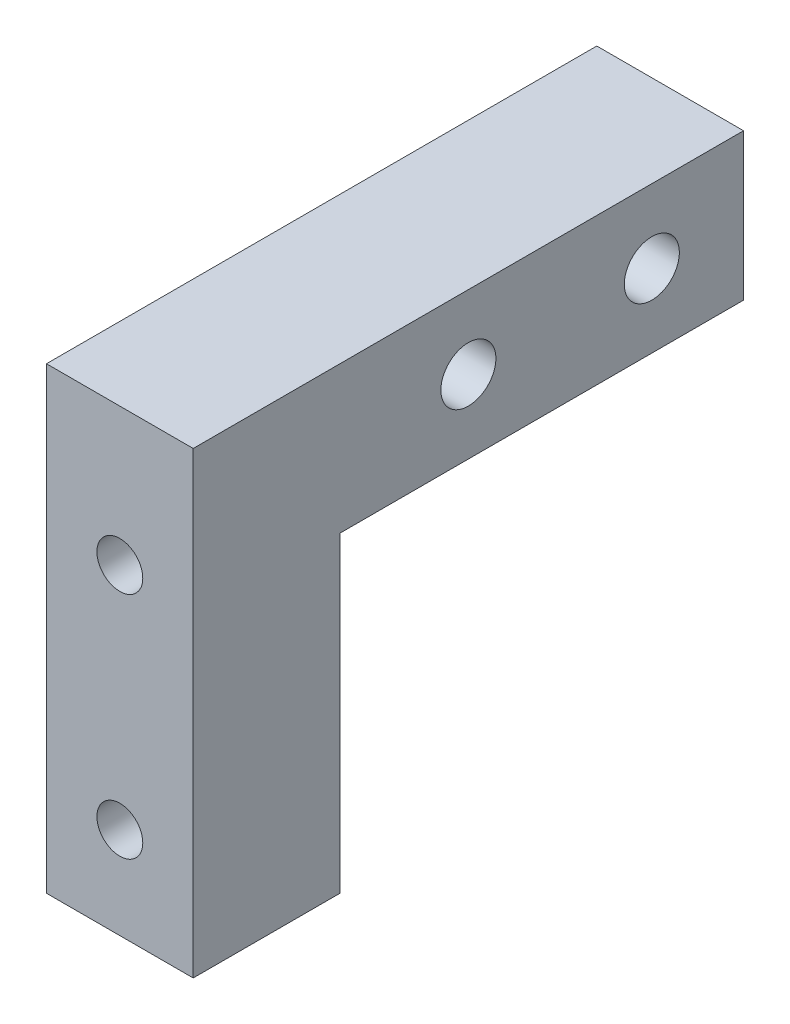
ISO-10303-21;
HEADER;
FILE_DESCRIPTION(('STEP AP214'),'2;1');
FILE_NAME('part.step','',(''),(''),'','','');
FILE_SCHEMA(('AUTOMOTIVE_DESIGN { 1 0 10303 214 1 1 1 1 }'));
ENDSEC;
DATA;
#1=APPLICATION_CONTEXT('core data for automotive mechanical design processes');
#2=APPLICATION_PROTOCOL_DEFINITION('international standard','automotive_design',2000,#1);
#3=PRODUCT_CONTEXT('',#1,'mechanical');
#4=PRODUCT('Part','Part','',(#3));
#5=PRODUCT_RELATED_PRODUCT_CATEGORY('part','',(#4));
#6=PRODUCT_DEFINITION_FORMATION('','',#4);
#7=PRODUCT_DEFINITION_CONTEXT('part definition',#1,'design');
#8=PRODUCT_DEFINITION('design','',#6,#7);
#9=PRODUCT_DEFINITION_SHAPE('','',#8);
#10=(LENGTH_UNIT() NAMED_UNIT(*) SI_UNIT(.MILLI.,.METRE.));
#11=(NAMED_UNIT(*) PLANE_ANGLE_UNIT() SI_UNIT($,.RADIAN.));
#12=(NAMED_UNIT(*) SI_UNIT($,.STERADIAN.) SOLID_ANGLE_UNIT());
#13=UNCERTAINTY_MEASURE_WITH_UNIT(LENGTH_MEASURE(1.E-05),#10,'distance_accuracy_value','');
#14=(GEOMETRIC_REPRESENTATION_CONTEXT(3) GLOBAL_UNCERTAINTY_ASSIGNED_CONTEXT((#13)) GLOBAL_UNIT_ASSIGNED_CONTEXT((#10,
#11,#12)) REPRESENTATION_CONTEXT('',''));
#15=CARTESIAN_POINT('',(0.,0.,0.));
#16=DIRECTION('',(0.,0.,1.));
#17=DIRECTION('',(1.,0.,0.));
#18=AXIS2_PLACEMENT_3D('',#15,#16,#17);
#19=CARTESIAN_POINT('',(8.,0.,-44.));
#20=DIRECTION('',(0.,1.,0.));
#21=DIRECTION('',(0.,0.,1.));
#22=AXIS2_PLACEMENT_3D('',#19,#20,#21);
#23=PLANE('',#22);
#24=DIRECTION('',(0.,0.,-1.));
#25=VECTOR('',#24,1.);
#26=CARTESIAN_POINT('',(-8.,0.,-44.));
#27=LINE('',#26,#25);
#28=CARTESIAN_POINT('',(-8.,0.,0.));
#29=VERTEX_POINT('',#28);
#30=CARTESIAN_POINT('',(-8.,0.,-44.));
#31=VERTEX_POINT('',#30);
#32=EDGE_CURVE('E125',#29,#31,#27,.T.);
#33=ORIENTED_EDGE('',*,*,#32,.T.);
#34=DIRECTION('',(-1.,0.,0.));
#35=VECTOR('',#34,1.);
#36=CARTESIAN_POINT('',(8.,0.,-44.));
#37=LINE('',#36,#35);
#38=CARTESIAN_POINT('',(8.,0.,-44.));
#39=VERTEX_POINT('',#38);
#40=EDGE_CURVE('E11',#39,#31,#37,.T.);
#41=ORIENTED_EDGE('',*,*,#40,.F.);
#42=DIRECTION('',(0.,0.,-1.));
#43=VECTOR('',#42,1.);
#44=CARTESIAN_POINT('',(8.,0.,-44.));
#45=LINE('',#44,#43);
#46=CARTESIAN_POINT('',(8.,0.,0.));
#47=VERTEX_POINT('',#46);
#48=EDGE_CURVE('E136',#47,#39,#45,.T.);
#49=ORIENTED_EDGE('',*,*,#48,.F.);
#50=DIRECTION('',(-1.,0.,0.));
#51=VECTOR('',#50,1.);
#52=CARTESIAN_POINT('',(8.,0.,0.));
#53=LINE('',#52,#51);
#54=EDGE_CURVE('E121',#47,#29,#53,.T.);
#55=ORIENTED_EDGE('',*,*,#54,.T.);
#56=EDGE_LOOP('',(#33,#41,#49,#55));
#57=FACE_BOUND('',#56,.T.);
#58=ADVANCED_FACE('F38',(#57),#23,.F.);
#59=CARTESIAN_POINT('',(8.,16.,-44.));
#60=DIRECTION('',(0.,0.,1.));
#61=DIRECTION('',(1.,0.,0.));
#62=AXIS2_PLACEMENT_3D('',#59,#60,#61);
#63=PLANE('',#62);
#64=DIRECTION('',(0.,1.,0.));
#65=VECTOR('',#64,1.);
#66=CARTESIAN_POINT('',(-8.,16.,-44.));
#67=LINE('',#66,#65);
#68=CARTESIAN_POINT('',(-8.,16.,-44.));
#69=VERTEX_POINT('',#68);
#70=EDGE_CURVE('E128',#31,#69,#67,.T.);
#71=ORIENTED_EDGE('',*,*,#70,.T.);
#72=DIRECTION('',(-1.,0.,0.));
#73=VECTOR('',#72,1.);
#74=CARTESIAN_POINT('',(8.,16.,-44.));
#75=LINE('',#74,#73);
#76=CARTESIAN_POINT('',(8.,16.,-44.));
#77=VERTEX_POINT('',#76);
#78=EDGE_CURVE('E46',#77,#69,#75,.T.);
#79=ORIENTED_EDGE('',*,*,#78,.F.);
#80=DIRECTION('',(0.,1.,0.));
#81=VECTOR('',#80,1.);
#82=CARTESIAN_POINT('',(8.,16.,-44.));
#83=LINE('',#82,#81);
#84=EDGE_CURVE('E92',#39,#77,#83,.T.);
#85=ORIENTED_EDGE('',*,*,#84,.F.);
#86=ORIENTED_EDGE('',*,*,#40,.T.);
#87=EDGE_LOOP('',(#71,#79,#85,#86));
#88=FACE_BOUND('',#87,.T.);
#89=ADVANCED_FACE('F161',(#88),#63,.F.);
#90=CARTESIAN_POINT('',(8.,16.,16.));
#91=DIRECTION('',(0.,-1.,0.));
#92=DIRECTION('',(0.,0.,-1.));
#93=AXIS2_PLACEMENT_3D('',#90,#91,#92);
#94=PLANE('',#93);
#95=DIRECTION('',(0.,0.,1.));
#96=VECTOR('',#95,1.);
#97=CARTESIAN_POINT('',(-8.,16.,16.));
#98=LINE('',#97,#96);
#99=CARTESIAN_POINT('',(-8.,16.,16.));
#100=VERTEX_POINT('',#99);
#101=EDGE_CURVE('E131',#69,#100,#98,.T.);
#102=ORIENTED_EDGE('',*,*,#101,.T.);
#103=DIRECTION('',(-1.,0.,0.));
#104=VECTOR('',#103,1.);
#105=CARTESIAN_POINT('',(8.,16.,16.));
#106=LINE('',#105,#104);
#107=CARTESIAN_POINT('',(8.,16.,16.));
#108=VERTEX_POINT('',#107);
#109=EDGE_CURVE('E116',#108,#100,#106,.T.);
#110=ORIENTED_EDGE('',*,*,#109,.F.);
#111=DIRECTION('',(0.,0.,1.));
#112=VECTOR('',#111,1.);
#113=CARTESIAN_POINT('',(8.,16.,16.));
#114=LINE('',#113,#112);
#115=EDGE_CURVE('E107',#77,#108,#114,.T.);
#116=ORIENTED_EDGE('',*,*,#115,.F.);
#117=ORIENTED_EDGE('',*,*,#78,.T.);
#118=EDGE_LOOP('',(#102,#110,#116,#117));
#119=FACE_BOUND('',#118,.T.);
#120=ADVANCED_FACE('F142',(#119),#94,.F.);
#121=CARTESIAN_POINT('',(8.,-34.,16.));
#122=DIRECTION('',(0.,0.,-1.));
#123=DIRECTION('',(-1.,0.,0.));
#124=AXIS2_PLACEMENT_3D('',#121,#122,#123);
#125=PLANE('',#124);
#126=CARTESIAN_POINT('',(0.,1.,16.));
#127=DIRECTION('',(0.,0.,1.));
#128=DIRECTION('',(1.,0.,0.));
#129=AXIS2_PLACEMENT_3D('',#126,#127,#128);
#130=CIRCLE('',#129,2.49999999999999);
#131=CARTESIAN_POINT('',(2.49999999999999,1.,16.));
#132=VERTEX_POINT('',#131);
#133=EDGE_CURVE('E177',#132,#132,#130,.T.);
#134=ORIENTED_EDGE('',*,*,#133,.F.);
#135=EDGE_LOOP('',(#134));
#136=FACE_BOUND('',#135,.T.);
#137=CARTESIAN_POINT('',(0.,-24.,16.));
#138=DIRECTION('',(0.,0.,1.));
#139=DIRECTION('',(1.,0.,0.));
#140=AXIS2_PLACEMENT_3D('',#137,#138,#139);
#141=CIRCLE('',#140,2.49999999999999);
#142=CARTESIAN_POINT('',(2.5,-24.,16.));
#143=VERTEX_POINT('',#142);
#144=EDGE_CURVE('E180',#143,#143,#141,.T.);
#145=ORIENTED_EDGE('',*,*,#144,.F.);
#146=EDGE_LOOP('',(#145));
#147=FACE_BOUND('',#146,.T.);
#148=DIRECTION('',(0.,-1.,0.));
#149=VECTOR('',#148,1.);
#150=CARTESIAN_POINT('',(-8.,-34.,16.));
#151=LINE('',#150,#149);
#152=CARTESIAN_POINT('',(-8.,-34.,16.));
#153=VERTEX_POINT('',#152);
#154=EDGE_CURVE('E115',#100,#153,#151,.T.);
#155=ORIENTED_EDGE('',*,*,#154,.T.);
#156=DIRECTION('',(-1.,0.,0.));
#157=VECTOR('',#156,1.);
#158=CARTESIAN_POINT('',(8.,-34.,16.));
#159=LINE('',#158,#157);
#160=CARTESIAN_POINT('',(8.,-34.,16.));
#161=VERTEX_POINT('',#160);
#162=EDGE_CURVE('E112',#161,#153,#159,.T.);
#163=ORIENTED_EDGE('',*,*,#162,.F.);
#164=DIRECTION('',(0.,-1.,0.));
#165=VECTOR('',#164,1.);
#166=CARTESIAN_POINT('',(8.,-34.,16.));
#167=LINE('',#166,#165);
#168=EDGE_CURVE('E101',#108,#161,#167,.T.);
#169=ORIENTED_EDGE('',*,*,#168,.F.);
#170=ORIENTED_EDGE('',*,*,#109,.T.);
#171=EDGE_LOOP('',(#155,#163,#169,#170));
#172=FACE_BOUND('',#171,.T.);
#173=ADVANCED_FACE('F113',(#136,#147,#172),#125,.F.);
#174=CARTESIAN_POINT('',(8.,-34.,0.));
#175=DIRECTION('',(0.,1.,0.));
#176=DIRECTION('',(0.,0.,1.));
#177=AXIS2_PLACEMENT_3D('',#174,#175,#176);
#178=PLANE('',#177);
#179=DIRECTION('',(0.,0.,-1.));
#180=VECTOR('',#179,1.);
#181=CARTESIAN_POINT('',(-8.,-34.,0.));
#182=LINE('',#181,#180);
#183=CARTESIAN_POINT('',(-8.,-34.,0.));
#184=VERTEX_POINT('',#183);
#185=EDGE_CURVE('E78',#153,#184,#182,.T.);
#186=ORIENTED_EDGE('',*,*,#185,.T.);
#187=DIRECTION('',(-1.,0.,0.));
#188=VECTOR('',#187,1.);
#189=CARTESIAN_POINT('',(8.,-34.,0.));
#190=LINE('',#189,#188);
#191=CARTESIAN_POINT('',(8.,-34.,0.));
#192=VERTEX_POINT('',#191);
#193=EDGE_CURVE('E117',#192,#184,#190,.T.);
#194=ORIENTED_EDGE('',*,*,#193,.F.);
#195=DIRECTION('',(0.,0.,-1.));
#196=VECTOR('',#195,1.);
#197=CARTESIAN_POINT('',(8.,-34.,0.));
#198=LINE('',#197,#196);
#199=EDGE_CURVE('E105',#161,#192,#198,.T.);
#200=ORIENTED_EDGE('',*,*,#199,.F.);
#201=ORIENTED_EDGE('',*,*,#162,.T.);
#202=EDGE_LOOP('',(#186,#194,#200,#201));
#203=FACE_BOUND('',#202,.T.);
#204=ADVANCED_FACE('F119',(#203),#178,.F.);
#205=CARTESIAN_POINT('',(8.,0.,0.));
#206=DIRECTION('',(0.,0.,1.));
#207=DIRECTION('',(0.,-1.,0.));
#208=AXIS2_PLACEMENT_3D('',#205,#206,#207);
#209=PLANE('',#208);
#210=DIRECTION('',(0.,1.,0.));
#211=VECTOR('',#210,1.);
#212=CARTESIAN_POINT('',(-8.,0.,0.));
#213=LINE('',#212,#211);
#214=EDGE_CURVE('E84',#184,#29,#213,.T.);
#215=ORIENTED_EDGE('',*,*,#214,.T.);
#216=ORIENTED_EDGE('',*,*,#54,.F.);
#217=DIRECTION('',(0.,1.,0.));
#218=VECTOR('',#217,1.);
#219=CARTESIAN_POINT('',(8.,0.,0.));
#220=LINE('',#219,#218);
#221=EDGE_CURVE('E54',#192,#47,#220,.T.);
#222=ORIENTED_EDGE('',*,*,#221,.F.);
#223=ORIENTED_EDGE('',*,*,#193,.T.);
#224=EDGE_LOOP('',(#215,#216,#222,#223));
#225=FACE_BOUND('',#224,.T.);
#226=ADVANCED_FACE('F149',(#225),#209,.F.);
#227=CARTESIAN_POINT('',(8.,0.,0.));
#228=DIRECTION('',(1.,0.,0.));
#229=DIRECTION('',(0.,0.,-1.));
#230=AXIS2_PLACEMENT_3D('',#227,#228,#229);
#231=PLANE('',#230);
#232=CARTESIAN_POINT('',(8.,8.,-13.9999999999998));
#233=DIRECTION('',(-1.,0.,0.));
#234=DIRECTION('',(0.,0.,1.));
#235=AXIS2_PLACEMENT_3D('',#232,#233,#234);
#236=CIRCLE('',#235,3.);
#237=CARTESIAN_POINT('',(8.,8.,-10.9999999999998));
#238=VERTEX_POINT('',#237);
#239=EDGE_CURVE('E192',#238,#238,#236,.T.);
#240=ORIENTED_EDGE('',*,*,#239,.T.);
#241=EDGE_LOOP('',(#240));
#242=FACE_BOUND('',#241,.T.);
#243=CARTESIAN_POINT('',(8.,8.,-33.9999999999998));
#244=DIRECTION('',(-1.,0.,0.));
#245=DIRECTION('',(0.,0.,1.));
#246=AXIS2_PLACEMENT_3D('',#243,#244,#245);
#247=CIRCLE('',#246,3.);
#248=CARTESIAN_POINT('',(8.,8.,-30.9999999999998));
#249=VERTEX_POINT('',#248);
#250=EDGE_CURVE('E129',#249,#249,#247,.T.);
#251=ORIENTED_EDGE('',*,*,#250,.T.);
#252=EDGE_LOOP('',(#251));
#253=FACE_BOUND('',#252,.T.);
#254=ORIENTED_EDGE('',*,*,#48,.T.);
#255=ORIENTED_EDGE('',*,*,#84,.T.);
#256=ORIENTED_EDGE('',*,*,#115,.T.);
#257=ORIENTED_EDGE('',*,*,#168,.T.);
#258=ORIENTED_EDGE('',*,*,#199,.T.);
#259=ORIENTED_EDGE('',*,*,#221,.T.);
#260=EDGE_LOOP('',(#254,#255,#256,#257,#258,#259));
#261=FACE_BOUND('',#260,.T.);
#262=ADVANCED_FACE('F103',(#242,#253,#261),#231,.T.);
#263=CARTESIAN_POINT('',(-8.,0.,0.));
#264=DIRECTION('',(1.,0.,0.));
#265=DIRECTION('',(0.,0.,-1.));
#266=AXIS2_PLACEMENT_3D('',#263,#264,#265);
#267=PLANE('',#266);
#268=CARTESIAN_POINT('',(-8.,8.,-13.9999999999998));
#269=DIRECTION('',(-1.,0.,0.));
#270=DIRECTION('',(0.,0.,1.));
#271=AXIS2_PLACEMENT_3D('',#268,#269,#270);
#272=CIRCLE('',#271,3.);
#273=CARTESIAN_POINT('',(-8.,8.,-10.9999999999998));
#274=VERTEX_POINT('',#273);
#275=EDGE_CURVE('E186',#274,#274,#272,.T.);
#276=ORIENTED_EDGE('',*,*,#275,.F.);
#277=EDGE_LOOP('',(#276));
#278=FACE_BOUND('',#277,.T.);
#279=CARTESIAN_POINT('',(-8.,8.,-33.9999999999998));
#280=DIRECTION('',(-1.,0.,0.));
#281=DIRECTION('',(0.,0.,1.));
#282=AXIS2_PLACEMENT_3D('',#279,#280,#281);
#283=CIRCLE('',#282,3.);
#284=CARTESIAN_POINT('',(-8.,8.,-30.9999999999998));
#285=VERTEX_POINT('',#284);
#286=EDGE_CURVE('E195',#285,#285,#283,.T.);
#287=ORIENTED_EDGE('',*,*,#286,.F.);
#288=EDGE_LOOP('',(#287));
#289=FACE_BOUND('',#288,.T.);
#290=ORIENTED_EDGE('',*,*,#32,.F.);
#291=ORIENTED_EDGE('',*,*,#214,.F.);
#292=ORIENTED_EDGE('',*,*,#185,.F.);
#293=ORIENTED_EDGE('',*,*,#154,.F.);
#294=ORIENTED_EDGE('',*,*,#101,.F.);
#295=ORIENTED_EDGE('',*,*,#70,.F.);
#296=EDGE_LOOP('',(#290,#291,#292,#293,#294,#295));
#297=FACE_BOUND('',#296,.T.);
#298=ADVANCED_FACE('F145',(#278,#289,#297),#267,.F.);
#299=CARTESIAN_POINT('',(8.,8.,-33.9999999999998));
#300=DIRECTION('',(-1.,0.,0.));
#301=DIRECTION('',(0.,0.,1.));
#302=AXIS2_PLACEMENT_3D('',#299,#300,#301);
#303=CYLINDRICAL_SURFACE('',#302,3.);
#304=ORIENTED_EDGE('',*,*,#250,.F.);
#305=EDGE_LOOP('',(#304));
#306=FACE_BOUND('',#305,.T.);
#307=ORIENTED_EDGE('',*,*,#286,.T.);
#308=EDGE_LOOP('',(#307));
#309=FACE_BOUND('',#308,.T.);
#310=ADVANCED_FACE('F205',(#306,#309),#303,.F.);
#311=CARTESIAN_POINT('',(8.,8.,-13.9999999999998));
#312=DIRECTION('',(-1.,0.,0.));
#313=DIRECTION('',(0.,0.,1.));
#314=AXIS2_PLACEMENT_3D('',#311,#312,#313);
#315=CYLINDRICAL_SURFACE('',#314,3.);
#316=ORIENTED_EDGE('',*,*,#239,.F.);
#317=EDGE_LOOP('',(#316));
#318=FACE_BOUND('',#317,.T.);
#319=ORIENTED_EDGE('',*,*,#275,.T.);
#320=EDGE_LOOP('',(#319));
#321=FACE_BOUND('',#320,.T.);
#322=ADVANCED_FACE('F212',(#318,#321),#315,.F.);
#323=CARTESIAN_POINT('',(0.,-24.,4.));
#324=DIRECTION('',(0.,0.,1.));
#325=DIRECTION('',(1.,0.,0.));
#326=AXIS2_PLACEMENT_3D('',#323,#324,#325);
#327=CONICAL_SURFACE('',#326,2.49999999999999,1.02974425867665);
#328=CARTESIAN_POINT('',(0.,-24.,2.4978484524311));
#329=VERTEX_POINT('',#328);
#330=VERTEX_LOOP('',#329);
#331=FACE_BOUND('',#330,.T.);
#332=CARTESIAN_POINT('',(0.,-24.,4.));
#333=DIRECTION('',(0.,0.,1.));
#334=DIRECTION('',(1.,0.,0.));
#335=AXIS2_PLACEMENT_3D('',#332,#333,#334);
#336=CIRCLE('',#335,2.49999999999999);
#337=CARTESIAN_POINT('',(2.49999999999999,-24.,4.));
#338=VERTEX_POINT('',#337);
#339=EDGE_CURVE('E182',#338,#338,#336,.T.);
#340=ORIENTED_EDGE('',*,*,#339,.T.);
#341=EDGE_LOOP('',(#340));
#342=FACE_BOUND('',#341,.T.);
#343=ADVANCED_FACE('F219',(#331,#342),#327,.F.);
#344=CARTESIAN_POINT('',(0.,-24.,16.));
#345=DIRECTION('',(0.,0.,1.));
#346=DIRECTION('',(1.,0.,0.));
#347=AXIS2_PLACEMENT_3D('',#344,#345,#346);
#348=CYLINDRICAL_SURFACE('',#347,2.49999999999999);
#349=ORIENTED_EDGE('',*,*,#339,.F.);
#350=EDGE_LOOP('',(#349));
#351=FACE_BOUND('',#350,.T.);
#352=ORIENTED_EDGE('',*,*,#144,.T.);
#353=EDGE_LOOP('',(#352));
#354=FACE_BOUND('',#353,.T.);
#355=ADVANCED_FACE('F223',(#351,#354),#348,.F.);
#356=CARTESIAN_POINT('',(0.,1.,4.));
#357=DIRECTION('',(0.,0.,1.));
#358=DIRECTION('',(1.,0.,0.));
#359=AXIS2_PLACEMENT_3D('',#356,#357,#358);
#360=CONICAL_SURFACE('',#359,2.49999999999999,1.02974425867665);
#361=CARTESIAN_POINT('',(0.,1.,2.4978484524311));
#362=VERTEX_POINT('',#361);
#363=VERTEX_LOOP('',#362);
#364=FACE_BOUND('',#363,.T.);
#365=CARTESIAN_POINT('',(0.,1.,4.));
#366=DIRECTION('',(0.,0.,1.));
#367=DIRECTION('',(1.,0.,0.));
#368=AXIS2_PLACEMENT_3D('',#365,#366,#367);
#369=CIRCLE('',#368,2.49999999999999);
#370=CARTESIAN_POINT('',(2.49999999999999,1.,4.));
#371=VERTEX_POINT('',#370);
#372=EDGE_CURVE('E183',#371,#371,#369,.T.);
#373=ORIENTED_EDGE('',*,*,#372,.T.);
#374=EDGE_LOOP('',(#373));
#375=FACE_BOUND('',#374,.T.);
#376=ADVANCED_FACE('F227',(#364,#375),#360,.F.);
#377=CARTESIAN_POINT('',(0.,1.,16.));
#378=DIRECTION('',(0.,0.,1.));
#379=DIRECTION('',(1.,0.,0.));
#380=AXIS2_PLACEMENT_3D('',#377,#378,#379);
#381=CYLINDRICAL_SURFACE('',#380,2.49999999999999);
#382=ORIENTED_EDGE('',*,*,#372,.F.);
#383=EDGE_LOOP('',(#382));
#384=FACE_BOUND('',#383,.T.);
#385=ORIENTED_EDGE('',*,*,#133,.T.);
#386=EDGE_LOOP('',(#385));
#387=FACE_BOUND('',#386,.T.);
#388=ADVANCED_FACE('F231',(#384,#387),#381,.F.);
#389=CLOSED_SHELL('',(#58,#89,#120,#173,#204,#226,#262,#298,#310,#322,#343,#355,#376,#388));
#390=MANIFOLD_SOLID_BREP('B2',#389);
#391=ADVANCED_BREP_SHAPE_REPRESENTATION('',(#18,#390),#14);
#392=SHAPE_DEFINITION_REPRESENTATION(#9,#391);
ENDSEC;
END-ISO-10303-21;
